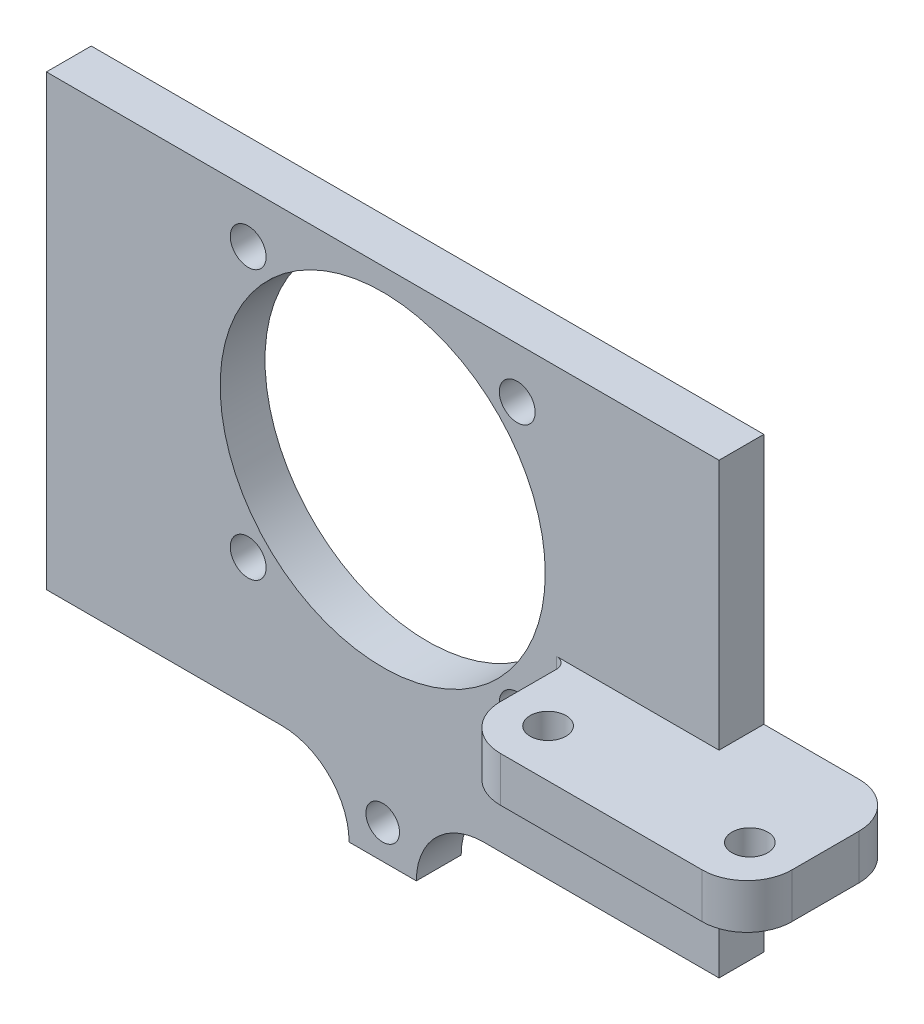
ISO-10303-21;
HEADER;
FILE_DESCRIPTION(('STEP AP214'),'2;1');
FILE_NAME('part.step','',(''),(''),'','','');
FILE_SCHEMA(('AUTOMOTIVE_DESIGN { 1 0 10303 214 1 1 1 1 }'));
ENDSEC;
DATA;
#1=APPLICATION_CONTEXT('core data for automotive mechanical design processes');
#2=APPLICATION_PROTOCOL_DEFINITION('international standard','automotive_design',2000,#1);
#3=PRODUCT_CONTEXT('',#1,'mechanical');
#4=PRODUCT('Part','Part','',(#3));
#5=PRODUCT_RELATED_PRODUCT_CATEGORY('part','',(#4));
#6=PRODUCT_DEFINITION_FORMATION('','',#4);
#7=PRODUCT_DEFINITION_CONTEXT('part definition',#1,'design');
#8=PRODUCT_DEFINITION('design','',#6,#7);
#9=PRODUCT_DEFINITION_SHAPE('','',#8);
#10=(LENGTH_UNIT() NAMED_UNIT(*) SI_UNIT(.MILLI.,.METRE.));
#11=(NAMED_UNIT(*) PLANE_ANGLE_UNIT() SI_UNIT($,.RADIAN.));
#12=(NAMED_UNIT(*) SI_UNIT($,.STERADIAN.) SOLID_ANGLE_UNIT());
#13=UNCERTAINTY_MEASURE_WITH_UNIT(LENGTH_MEASURE(1.E-05),#10,'distance_accuracy_value','');
#14=(GEOMETRIC_REPRESENTATION_CONTEXT(3) GLOBAL_UNCERTAINTY_ASSIGNED_CONTEXT((#13)) GLOBAL_UNIT_ASSIGNED_CONTEXT((#10,
#11,#12)) REPRESENTATION_CONTEXT('',''));
#15=CARTESIAN_POINT('',(0.,0.,0.));
#16=DIRECTION('',(0.,0.,1.));
#17=DIRECTION('',(1.,0.,0.));
#18=AXIS2_PLACEMENT_3D('',#15,#16,#17);
#19=CARTESIAN_POINT('',(0.,0.,4.));
#20=DIRECTION('',(0.,1.,0.));
#21=DIRECTION('',(0.,0.,1.));
#22=AXIS2_PLACEMENT_3D('',#19,#20,#21);
#23=PLANE('',#22);
#24=DIRECTION('',(1.,0.,0.));
#25=VECTOR('',#24,1.);
#26=CARTESIAN_POINT('',(0.,0.,4.));
#27=LINE('',#26,#25);
#28=CARTESIAN_POINT('',(39.,0.,4.));
#29=VERTEX_POINT('',#28);
#30=CARTESIAN_POINT('',(60.,0.,4.));
#31=VERTEX_POINT('',#30);
#32=EDGE_CURVE('E268',#29,#31,#27,.T.);
#33=ORIENTED_EDGE('',*,*,#32,.F.);
#34=DIRECTION('',(0.,0.,1.));
#35=VECTOR('',#34,1.);
#36=CARTESIAN_POINT('',(39.,0.,0.));
#37=LINE('',#36,#35);
#38=CARTESIAN_POINT('',(39.,0.,0.));
#39=VERTEX_POINT('',#38);
#40=EDGE_CURVE('E56',#29,#39,#37,.F.);
#41=ORIENTED_EDGE('',*,*,#40,.T.);
#42=DIRECTION('',(1.,0.,0.));
#43=VECTOR('',#42,1.);
#44=CARTESIAN_POINT('',(0.,0.,0.));
#45=LINE('',#44,#43);
#46=CARTESIAN_POINT('',(60.,0.,0.));
#47=VERTEX_POINT('',#46);
#48=EDGE_CURVE('E280',#39,#47,#45,.T.);
#49=ORIENTED_EDGE('',*,*,#48,.T.);
#50=DIRECTION('',(0.,0.,-1.));
#51=VECTOR('',#50,1.);
#52=CARTESIAN_POINT('',(60.,0.,4.));
#53=LINE('',#52,#51);
#54=EDGE_CURVE('E294',#31,#47,#53,.T.);
#55=ORIENTED_EDGE('',*,*,#54,.F.);
#56=EDGE_LOOP('',(#33,#41,#49,#55));
#57=FACE_BOUND('',#56,.T.);
#58=ADVANCED_FACE('F35',(#57),#23,.F.);
#59=CARTESIAN_POINT('',(0.,0.,0.));
#60=VERTEX_POINT('',#59);
#61=CARTESIAN_POINT('',(21.,0.,0.));
#62=VERTEX_POINT('',#61);
#63=EDGE_CURVE('E281',#60,#62,#45,.T.);
#64=ORIENTED_EDGE('',*,*,#63,.T.);
#65=DIRECTION('',(0.,0.,-1.));
#66=VECTOR('',#65,1.);
#67=CARTESIAN_POINT('',(21.,0.,4.));
#68=LINE('',#67,#66);
#69=CARTESIAN_POINT('',(21.,0.,4.));
#70=VERTEX_POINT('',#69);
#71=EDGE_CURVE('E343',#62,#70,#68,.F.);
#72=ORIENTED_EDGE('',*,*,#71,.T.);
#73=CARTESIAN_POINT('',(0.,0.,4.));
#74=VERTEX_POINT('',#73);
#75=EDGE_CURVE('E270',#74,#70,#27,.T.);
#76=ORIENTED_EDGE('',*,*,#75,.F.);
#77=DIRECTION('',(0.,0.,-1.));
#78=VECTOR('',#77,1.);
#79=CARTESIAN_POINT('',(0.,0.,4.));
#80=LINE('',#79,#78);
#81=EDGE_CURVE('E222',#74,#60,#80,.T.);
#82=ORIENTED_EDGE('',*,*,#81,.T.);
#83=EDGE_LOOP('',(#64,#72,#76,#82));
#84=FACE_BOUND('',#83,.T.);
#85=ADVANCED_FACE('F359',(#84),#23,.F.);
#86=CARTESIAN_POINT('',(60.,0.,4.));
#87=DIRECTION('',(-1.,0.,0.));
#88=DIRECTION('',(0.,0.,1.));
#89=AXIS2_PLACEMENT_3D('',#86,#87,#88);
#90=PLANE('',#89);
#91=DIRECTION('',(0.,1.,0.));
#92=VECTOR('',#91,1.);
#93=CARTESIAN_POINT('',(60.,0.,0.));
#94=LINE('',#93,#92);
#95=CARTESIAN_POINT('',(60.,12.5999999999763,0.));
#96=VERTEX_POINT('',#95);
#97=EDGE_CURVE('E285',#47,#96,#94,.T.);
#98=ORIENTED_EDGE('',*,*,#97,.T.);
#99=DIRECTION('',(0.,0.,-1.));
#100=VECTOR('',#99,1.);
#101=CARTESIAN_POINT('',(60.,12.5999999999763,4.));
#102=LINE('',#101,#100);
#103=CARTESIAN_POINT('',(60.,12.5999999999763,4.));
#104=VERTEX_POINT('',#103);
#105=EDGE_CURVE('E330',#96,#104,#102,.F.);
#106=ORIENTED_EDGE('',*,*,#105,.T.);
#107=DIRECTION('',(0.,1.,0.));
#108=VECTOR('',#107,1.);
#109=CARTESIAN_POINT('',(60.,0.,4.));
#110=LINE('',#109,#108);
#111=EDGE_CURVE('E273',#31,#104,#110,.T.);
#112=ORIENTED_EDGE('',*,*,#111,.F.);
#113=ORIENTED_EDGE('',*,*,#54,.T.);
#114=EDGE_LOOP('',(#98,#106,#112,#113));
#115=FACE_BOUND('',#114,.T.);
#116=ADVANCED_FACE('F377',(#115),#90,.F.);
#117=DIRECTION('',(0.,0.,1.));
#118=VECTOR('',#117,1.);
#119=CARTESIAN_POINT('',(60.,17.5999999999763,4.));
#120=LINE('',#119,#118);
#121=CARTESIAN_POINT('',(60.,17.5999999999763,0.));
#122=VERTEX_POINT('',#121);
#123=CARTESIAN_POINT('',(60.,17.5999999999763,4.));
#124=VERTEX_POINT('',#123);
#125=EDGE_CURVE('E192',#122,#124,#120,.T.);
#126=ORIENTED_EDGE('',*,*,#125,.F.);
#127=CARTESIAN_POINT('',(60.,40.,0.));
#128=VERTEX_POINT('',#127);
#129=EDGE_CURVE('E284',#122,#128,#94,.T.);
#130=ORIENTED_EDGE('',*,*,#129,.T.);
#131=DIRECTION('',(0.,0.,-1.));
#132=VECTOR('',#131,1.);
#133=CARTESIAN_POINT('',(60.,40.,4.));
#134=LINE('',#133,#132);
#135=CARTESIAN_POINT('',(60.,40.,4.));
#136=VERTEX_POINT('',#135);
#137=EDGE_CURVE('E291',#136,#128,#134,.T.);
#138=ORIENTED_EDGE('',*,*,#137,.F.);
#139=EDGE_CURVE('E272',#124,#136,#110,.T.);
#140=ORIENTED_EDGE('',*,*,#139,.F.);
#141=EDGE_LOOP('',(#126,#130,#138,#140));
#142=FACE_BOUND('',#141,.T.);
#143=ADVANCED_FACE('F444',(#142),#90,.F.);
#144=CARTESIAN_POINT('',(0.,0.,4.));
#145=DIRECTION('',(0.,0.,-1.));
#146=DIRECTION('',(-1.,0.,0.));
#147=AXIS2_PLACEMENT_3D('',#144,#145,#146);
#148=PLANE('',#147);
#149=CARTESIAN_POINT('',(30.,-3.,4.));
#150=DIRECTION('',(0.,0.,1.));
#151=DIRECTION('',(1.,0.,0.));
#152=AXIS2_PLACEMENT_3D('',#149,#150,#151);
#153=CIRCLE('',#152,1.5);
#154=CARTESIAN_POINT('',(31.5,-3.,4.));
#155=VERTEX_POINT('',#154);
#156=EDGE_CURVE('E185',#155,#155,#153,.T.);
#157=ORIENTED_EDGE('',*,*,#156,.F.);
#158=EDGE_LOOP('',(#157));
#159=FACE_BOUND('',#158,.T.);
#160=CARTESIAN_POINT('',(30.,23.5,4.));
#161=DIRECTION('',(0.,0.,1.));
#162=DIRECTION('',(1.,0.,0.));
#163=AXIS2_PLACEMENT_3D('',#160,#161,#162);
#164=CIRCLE('',#163,14.5);
#165=CARTESIAN_POINT('',(44.5,23.5,4.));
#166=VERTEX_POINT('',#165);
#167=EDGE_CURVE('E256',#166,#166,#164,.T.);
#168=ORIENTED_EDGE('',*,*,#167,.F.);
#169=EDGE_LOOP('',(#168));
#170=FACE_BOUND('',#169,.T.);
#171=CARTESIAN_POINT('',(42.0000000000001,11.4999999999967,4.));
#172=DIRECTION('',(0.,0.,1.));
#173=DIRECTION('',(1.,0.,0.));
#174=AXIS2_PLACEMENT_3D('',#171,#172,#173);
#175=CIRCLE('',#174,1.60000000000088);
#176=CARTESIAN_POINT('',(43.600000000001,11.4999999999967,4.));
#177=VERTEX_POINT('',#176);
#178=EDGE_CURVE('E238',#177,#177,#175,.T.);
#179=ORIENTED_EDGE('',*,*,#178,.F.);
#180=EDGE_LOOP('',(#179));
#181=FACE_BOUND('',#180,.T.);
#182=CARTESIAN_POINT('',(18.0000000000002,11.4999999999966,4.));
#183=DIRECTION('',(0.,0.,1.));
#184=DIRECTION('',(1.,0.,0.));
#185=AXIS2_PLACEMENT_3D('',#182,#183,#184);
#186=CIRCLE('',#185,1.60000000000088);
#187=CARTESIAN_POINT('',(19.6000000000011,11.4999999999966,4.));
#188=VERTEX_POINT('',#187);
#189=EDGE_CURVE('E239',#188,#188,#186,.T.);
#190=ORIENTED_EDGE('',*,*,#189,.F.);
#191=EDGE_LOOP('',(#190));
#192=FACE_BOUND('',#191,.T.);
#193=CARTESIAN_POINT('',(18.,35.4999999999966,4.));
#194=DIRECTION('',(0.,0.,1.));
#195=DIRECTION('',(1.,0.,0.));
#196=AXIS2_PLACEMENT_3D('',#193,#194,#195);
#197=CIRCLE('',#196,1.60000000000088);
#198=CARTESIAN_POINT('',(19.6000000000009,35.4999999999966,4.));
#199=VERTEX_POINT('',#198);
#200=EDGE_CURVE('E245',#199,#199,#197,.T.);
#201=ORIENTED_EDGE('',*,*,#200,.F.);
#202=EDGE_LOOP('',(#201));
#203=FACE_BOUND('',#202,.T.);
#204=CARTESIAN_POINT('',(42.0000000000001,35.4999999999967,4.));
#205=DIRECTION('',(0.,0.,1.));
#206=DIRECTION('',(1.,0.,0.));
#207=AXIS2_PLACEMENT_3D('',#204,#205,#206);
#208=CIRCLE('',#207,1.60000000000088);
#209=CARTESIAN_POINT('',(43.6000000000009,35.4999999999967,4.));
#210=VERTEX_POINT('',#209);
#211=EDGE_CURVE('E234',#210,#210,#208,.T.);
#212=ORIENTED_EDGE('',*,*,#211,.F.);
#213=EDGE_LOOP('',(#212));
#214=FACE_BOUND('',#213,.T.);
#215=ORIENTED_EDGE('',*,*,#111,.T.);
#216=DIRECTION('',(1.,0.,0.));
#217=VECTOR('',#216,1.);
#218=CARTESIAN_POINT('',(46.5000000000019,12.5999999999763,4.));
#219=LINE('',#218,#217);
#220=CARTESIAN_POINT('',(45.5000000000019,12.5999999999763,4.));
#221=VERTEX_POINT('',#220);
#222=EDGE_CURVE('E335',#104,#221,#219,.F.);
#223=ORIENTED_EDGE('',*,*,#222,.T.);
#224=DIRECTION('',(0.,-1.,0.));
#225=VECTOR('',#224,1.);
#226=CARTESIAN_POINT('',(45.5000000000019,17.5999999999763,4.));
#227=LINE('',#226,#225);
#228=CARTESIAN_POINT('',(45.5000000000019,17.5999999999763,4.));
#229=VERTEX_POINT('',#228);
#230=EDGE_CURVE('E332',#221,#229,#227,.F.);
#231=ORIENTED_EDGE('',*,*,#230,.T.);
#232=DIRECTION('',(-1.,0.,0.));
#233=VECTOR('',#232,1.);
#234=CARTESIAN_POINT('',(46.5000000000019,17.5999999999763,4.));
#235=LINE('',#234,#233);
#236=EDGE_CURVE('E219',#124,#229,#235,.T.);
#237=ORIENTED_EDGE('',*,*,#236,.F.);
#238=ORIENTED_EDGE('',*,*,#139,.T.);
#239=DIRECTION('',(-1.,0.,0.));
#240=VECTOR('',#239,1.);
#241=CARTESIAN_POINT('',(0.,40.,4.));
#242=LINE('',#241,#240);
#243=CARTESIAN_POINT('',(0.,40.,4.));
#244=VERTEX_POINT('',#243);
#245=EDGE_CURVE('E275',#136,#244,#242,.T.);
#246=ORIENTED_EDGE('',*,*,#245,.T.);
#247=DIRECTION('',(0.,-1.,0.));
#248=VECTOR('',#247,1.);
#249=CARTESIAN_POINT('',(0.,0.,4.));
#250=LINE('',#249,#248);
#251=EDGE_CURVE('E265',#244,#74,#250,.T.);
#252=ORIENTED_EDGE('',*,*,#251,.T.);
#253=ORIENTED_EDGE('',*,*,#75,.T.);
#254=CARTESIAN_POINT('',(21.,-6.,4.));
#255=DIRECTION('',(0.,0.,-1.));
#256=DIRECTION('',(-1.,0.,0.));
#257=AXIS2_PLACEMENT_3D('',#254,#255,#256);
#258=CIRCLE('',#257,6.);
#259=CARTESIAN_POINT('',(27.,-6.,4.));
#260=VERTEX_POINT('',#259);
#261=EDGE_CURVE('E166',#70,#260,#258,.T.);
#262=ORIENTED_EDGE('',*,*,#261,.T.);
#263=DIRECTION('',(-1.,0.,0.));
#264=VECTOR('',#263,1.);
#265=CARTESIAN_POINT('',(33.,-6.,4.));
#266=LINE('',#265,#264);
#267=CARTESIAN_POINT('',(33.,-6.,4.));
#268=VERTEX_POINT('',#267);
#269=EDGE_CURVE('E168',#268,#260,#266,.T.);
#270=ORIENTED_EDGE('',*,*,#269,.F.);
#271=CARTESIAN_POINT('',(39.,-6.,4.));
#272=DIRECTION('',(0.,0.,-1.));
#273=DIRECTION('',(-1.,0.,0.));
#274=AXIS2_PLACEMENT_3D('',#271,#272,#273);
#275=CIRCLE('',#274,6.);
#276=EDGE_CURVE('E43',#268,#29,#275,.T.);
#277=ORIENTED_EDGE('',*,*,#276,.T.);
#278=ORIENTED_EDGE('',*,*,#32,.T.);
#279=EDGE_LOOP('',(#215,#223,#231,#237,#238,#246,#252,#253,#262,#270,#277,#278));
#280=FACE_BOUND('',#279,.T.);
#281=ADVANCED_FACE('F170',(#159,#170,#181,#192,#203,#214,#280),#148,.F.);
#282=CARTESIAN_POINT('',(0.,0.,4.));
#283=DIRECTION('',(1.,0.,0.));
#284=DIRECTION('',(0.,0.,-1.));
#285=AXIS2_PLACEMENT_3D('',#282,#283,#284);
#286=PLANE('',#285);
#287=DIRECTION('',(0.,-1.,0.));
#288=VECTOR('',#287,1.);
#289=CARTESIAN_POINT('',(0.,0.,0.));
#290=LINE('',#289,#288);
#291=CARTESIAN_POINT('',(0.,40.,0.));
#292=VERTEX_POINT('',#291);
#293=EDGE_CURVE('E262',#292,#60,#290,.T.);
#294=ORIENTED_EDGE('',*,*,#293,.T.);
#295=ORIENTED_EDGE('',*,*,#81,.F.);
#296=ORIENTED_EDGE('',*,*,#251,.F.);
#297=DIRECTION('',(0.,0.,-1.));
#298=VECTOR('',#297,1.);
#299=CARTESIAN_POINT('',(0.,40.,4.));
#300=LINE('',#299,#298);
#301=EDGE_CURVE('E277',#244,#292,#300,.T.);
#302=ORIENTED_EDGE('',*,*,#301,.T.);
#303=EDGE_LOOP('',(#294,#295,#296,#302));
#304=FACE_BOUND('',#303,.T.);
#305=ADVANCED_FACE('F381',(#304),#286,.F.);
#306=CARTESIAN_POINT('',(0.,40.,4.));
#307=DIRECTION('',(0.,-1.,0.));
#308=DIRECTION('',(0.,0.,-1.));
#309=AXIS2_PLACEMENT_3D('',#306,#307,#308);
#310=PLANE('',#309);
#311=DIRECTION('',(-1.,0.,0.));
#312=VECTOR('',#311,1.);
#313=CARTESIAN_POINT('',(0.,40.,0.));
#314=LINE('',#313,#312);
#315=EDGE_CURVE('E269',#128,#292,#314,.T.);
#316=ORIENTED_EDGE('',*,*,#315,.T.);
#317=ORIENTED_EDGE('',*,*,#301,.F.);
#318=ORIENTED_EDGE('',*,*,#245,.F.);
#319=ORIENTED_EDGE('',*,*,#137,.T.);
#320=EDGE_LOOP('',(#316,#317,#318,#319));
#321=FACE_BOUND('',#320,.T.);
#322=ADVANCED_FACE('F384',(#321),#310,.F.);
#323=CARTESIAN_POINT('',(0.,0.,0.));
#324=DIRECTION('',(0.,0.,-1.));
#325=DIRECTION('',(-1.,0.,0.));
#326=AXIS2_PLACEMENT_3D('',#323,#324,#325);
#327=PLANE('',#326);
#328=CARTESIAN_POINT('',(30.,-3.,0.));
#329=DIRECTION('',(0.,0.,-1.));
#330=DIRECTION('',(-1.,0.,0.));
#331=AXIS2_PLACEMENT_3D('',#328,#329,#330);
#332=CIRCLE('',#331,1.5);
#333=CARTESIAN_POINT('',(28.5,-3.,0.));
#334=VERTEX_POINT('',#333);
#335=EDGE_CURVE('E182',#334,#334,#332,.T.);
#336=ORIENTED_EDGE('',*,*,#335,.F.);
#337=EDGE_LOOP('',(#336));
#338=FACE_BOUND('',#337,.T.);
#339=CARTESIAN_POINT('',(42.0000000000001,35.4999999999967,0.));
#340=DIRECTION('',(0.,0.,1.));
#341=DIRECTION('',(1.,0.,0.));
#342=AXIS2_PLACEMENT_3D('',#339,#340,#341);
#343=CIRCLE('',#342,1.60000000000088);
#344=CARTESIAN_POINT('',(43.6000000000009,35.4999999999967,0.));
#345=VERTEX_POINT('',#344);
#346=EDGE_CURVE('E248',#345,#345,#343,.T.);
#347=ORIENTED_EDGE('',*,*,#346,.T.);
#348=EDGE_LOOP('',(#347));
#349=FACE_BOUND('',#348,.T.);
#350=CARTESIAN_POINT('',(18.,35.4999999999966,0.));
#351=DIRECTION('',(0.,0.,1.));
#352=DIRECTION('',(1.,0.,0.));
#353=AXIS2_PLACEMENT_3D('',#350,#351,#352);
#354=CIRCLE('',#353,1.60000000000088);
#355=CARTESIAN_POINT('',(19.6000000000009,35.4999999999966,0.));
#356=VERTEX_POINT('',#355);
#357=EDGE_CURVE('E242',#356,#356,#354,.T.);
#358=ORIENTED_EDGE('',*,*,#357,.T.);
#359=EDGE_LOOP('',(#358));
#360=FACE_BOUND('',#359,.T.);
#361=CARTESIAN_POINT('',(18.0000000000002,11.4999999999966,0.));
#362=DIRECTION('',(0.,0.,1.));
#363=DIRECTION('',(1.,0.,0.));
#364=AXIS2_PLACEMENT_3D('',#361,#362,#363);
#365=CIRCLE('',#364,1.60000000000088);
#366=CARTESIAN_POINT('',(19.6000000000011,11.4999999999966,0.));
#367=VERTEX_POINT('',#366);
#368=EDGE_CURVE('E235',#367,#367,#365,.T.);
#369=ORIENTED_EDGE('',*,*,#368,.T.);
#370=EDGE_LOOP('',(#369));
#371=FACE_BOUND('',#370,.T.);
#372=CARTESIAN_POINT('',(42.0000000000001,11.4999999999967,0.));
#373=DIRECTION('',(0.,0.,1.));
#374=DIRECTION('',(1.,0.,0.));
#375=AXIS2_PLACEMENT_3D('',#372,#373,#374);
#376=CIRCLE('',#375,1.60000000000088);
#377=CARTESIAN_POINT('',(43.600000000001,11.4999999999967,0.));
#378=VERTEX_POINT('',#377);
#379=EDGE_CURVE('E253',#378,#378,#376,.T.);
#380=ORIENTED_EDGE('',*,*,#379,.T.);
#381=EDGE_LOOP('',(#380));
#382=FACE_BOUND('',#381,.T.);
#383=CARTESIAN_POINT('',(30.,23.5,0.));
#384=DIRECTION('',(0.,0.,1.));
#385=DIRECTION('',(1.,0.,0.));
#386=AXIS2_PLACEMENT_3D('',#383,#384,#385);
#387=CIRCLE('',#386,14.5);
#388=CARTESIAN_POINT('',(44.5,23.5,0.));
#389=VERTEX_POINT('',#388);
#390=EDGE_CURVE('E259',#389,#389,#387,.T.);
#391=ORIENTED_EDGE('',*,*,#390,.T.);
#392=EDGE_LOOP('',(#391));
#393=FACE_BOUND('',#392,.T.);
#394=DIRECTION('',(-1.,0.,0.));
#395=VECTOR('',#394,1.);
#396=CARTESIAN_POINT('',(72.5,17.5999999999763,0.));
#397=LINE('',#396,#395);
#398=CARTESIAN_POINT('',(68.5000000000019,17.5999999999763,0.));
#399=VERTEX_POINT('',#398);
#400=EDGE_CURVE('E194',#399,#122,#397,.T.);
#401=ORIENTED_EDGE('',*,*,#400,.F.);
#402=DIRECTION('',(0.,1.,0.));
#403=VECTOR('',#402,1.);
#404=CARTESIAN_POINT('',(68.5000000000019,13.5999999999763,0.));
#405=LINE('',#404,#403);
#406=CARTESIAN_POINT('',(68.5000000000019,13.5999999999763,0.));
#407=VERTEX_POINT('',#406);
#408=EDGE_CURVE('E309',#399,#407,#405,.F.);
#409=ORIENTED_EDGE('',*,*,#408,.T.);
#410=DIRECTION('',(-1.,0.,0.));
#411=VECTOR('',#410,1.);
#412=CARTESIAN_POINT('',(72.5,13.5999999999763,0.));
#413=LINE('',#412,#411);
#414=CARTESIAN_POINT('',(61.,13.5999999999763,0.));
#415=VERTEX_POINT('',#414);
#416=EDGE_CURVE('E197',#407,#415,#413,.T.);
#417=ORIENTED_EDGE('',*,*,#416,.T.);
#418=CARTESIAN_POINT('',(61.,12.5999999999763,0.));
#419=DIRECTION('',(0.,0.,-1.));
#420=DIRECTION('',(-1.,0.,0.));
#421=AXIS2_PLACEMENT_3D('',#418,#419,#420);
#422=CIRCLE('',#421,1.);
#423=EDGE_CURVE('E339',#415,#96,#422,.F.);
#424=ORIENTED_EDGE('',*,*,#423,.T.);
#425=ORIENTED_EDGE('',*,*,#97,.F.);
#426=ORIENTED_EDGE('',*,*,#48,.F.);
#427=CARTESIAN_POINT('',(39.,-6.,0.));
#428=DIRECTION('',(0.,0.,-1.));
#429=DIRECTION('',(-1.,0.,0.));
#430=AXIS2_PLACEMENT_3D('',#427,#428,#429);
#431=CIRCLE('',#430,6.);
#432=CARTESIAN_POINT('',(33.,-6.,0.));
#433=VERTEX_POINT('',#432);
#434=EDGE_CURVE('E11',#39,#433,#431,.F.);
#435=ORIENTED_EDGE('',*,*,#434,.T.);
#436=DIRECTION('',(1.,0.,0.));
#437=VECTOR('',#436,1.);
#438=CARTESIAN_POINT('',(33.,-6.,0.));
#439=LINE('',#438,#437);
#440=CARTESIAN_POINT('',(27.,-6.,0.));
#441=VERTEX_POINT('',#440);
#442=EDGE_CURVE('E181',#441,#433,#439,.T.);
#443=ORIENTED_EDGE('',*,*,#442,.F.);
#444=CARTESIAN_POINT('',(21.,-6.,0.));
#445=DIRECTION('',(0.,0.,-1.));
#446=DIRECTION('',(-1.,0.,0.));
#447=AXIS2_PLACEMENT_3D('',#444,#445,#446);
#448=CIRCLE('',#447,6.);
#449=EDGE_CURVE('E350',#441,#62,#448,.F.);
#450=ORIENTED_EDGE('',*,*,#449,.T.);
#451=ORIENTED_EDGE('',*,*,#63,.F.);
#452=ORIENTED_EDGE('',*,*,#293,.F.);
#453=ORIENTED_EDGE('',*,*,#315,.F.);
#454=ORIENTED_EDGE('',*,*,#129,.F.);
#455=EDGE_LOOP('',(#401,#409,#417,#424,#425,#426,#435,#443,#450,#451,#452,#453,#454));
#456=FACE_BOUND('',#455,.T.);
#457=ADVANCED_FACE('F354',(#338,#349,#360,#371,#382,#393,#456),#327,.T.);
#458=CARTESIAN_POINT('',(30.,23.5,0.));
#459=DIRECTION('',(0.,0.,1.));
#460=DIRECTION('',(1.,0.,0.));
#461=AXIS2_PLACEMENT_3D('',#458,#459,#460);
#462=CYLINDRICAL_SURFACE('',#461,14.5);
#463=ORIENTED_EDGE('',*,*,#390,.F.);
#464=EDGE_LOOP('',(#463));
#465=FACE_BOUND('',#464,.T.);
#466=ORIENTED_EDGE('',*,*,#167,.T.);
#467=EDGE_LOOP('',(#466));
#468=FACE_BOUND('',#467,.T.);
#469=ADVANCED_FACE('F478',(#465,#468),#462,.F.);
#470=CARTESIAN_POINT('',(42.0000000000001,11.4999999999967,0.));
#471=DIRECTION('',(0.,0.,1.));
#472=DIRECTION('',(1.,0.,0.));
#473=AXIS2_PLACEMENT_3D('',#470,#471,#472);
#474=CYLINDRICAL_SURFACE('',#473,1.60000000000088);
#475=ORIENTED_EDGE('',*,*,#379,.F.);
#476=EDGE_LOOP('',(#475));
#477=FACE_BOUND('',#476,.T.);
#478=ORIENTED_EDGE('',*,*,#178,.T.);
#479=EDGE_LOOP('',(#478));
#480=FACE_BOUND('',#479,.T.);
#481=ADVANCED_FACE('F492',(#477,#480),#474,.F.);
#482=CARTESIAN_POINT('',(18.0000000000002,11.4999999999966,0.));
#483=DIRECTION('',(0.,0.,1.));
#484=DIRECTION('',(1.,0.,0.));
#485=AXIS2_PLACEMENT_3D('',#482,#483,#484);
#486=CYLINDRICAL_SURFACE('',#485,1.60000000000088);
#487=ORIENTED_EDGE('',*,*,#368,.F.);
#488=EDGE_LOOP('',(#487));
#489=FACE_BOUND('',#488,.T.);
#490=ORIENTED_EDGE('',*,*,#189,.T.);
#491=EDGE_LOOP('',(#490));
#492=FACE_BOUND('',#491,.T.);
#493=ADVANCED_FACE('F499',(#489,#492),#486,.F.);
#494=CARTESIAN_POINT('',(18.,35.4999999999966,0.));
#495=DIRECTION('',(0.,0.,1.));
#496=DIRECTION('',(1.,0.,0.));
#497=AXIS2_PLACEMENT_3D('',#494,#495,#496);
#498=CYLINDRICAL_SURFACE('',#497,1.60000000000088);
#499=ORIENTED_EDGE('',*,*,#357,.F.);
#500=EDGE_LOOP('',(#499));
#501=FACE_BOUND('',#500,.T.);
#502=ORIENTED_EDGE('',*,*,#200,.T.);
#503=EDGE_LOOP('',(#502));
#504=FACE_BOUND('',#503,.T.);
#505=ADVANCED_FACE('F506',(#501,#504),#498,.F.);
#506=CARTESIAN_POINT('',(42.0000000000001,35.4999999999967,0.));
#507=DIRECTION('',(0.,0.,1.));
#508=DIRECTION('',(1.,0.,0.));
#509=AXIS2_PLACEMENT_3D('',#506,#507,#508);
#510=CYLINDRICAL_SURFACE('',#509,1.60000000000088);
#511=ORIENTED_EDGE('',*,*,#346,.F.);
#512=EDGE_LOOP('',(#511));
#513=FACE_BOUND('',#512,.T.);
#514=ORIENTED_EDGE('',*,*,#211,.T.);
#515=EDGE_LOOP('',(#514));
#516=FACE_BOUND('',#515,.T.);
#517=ADVANCED_FACE('F514',(#513,#516),#510,.F.);
#518=CARTESIAN_POINT('',(46.5000000000019,17.5999999999763,14.));
#519=DIRECTION('',(1.,0.,0.));
#520=DIRECTION('',(0.,0.,-1.));
#521=AXIS2_PLACEMENT_3D('',#518,#519,#520);
#522=PLANE('',#521);
#523=DIRECTION('',(0.,0.,-1.));
#524=VECTOR('',#523,1.);
#525=CARTESIAN_POINT('',(46.5000000000019,17.5999999999763,14.));
#526=LINE('',#525,#524);
#527=CARTESIAN_POINT('',(46.5000000000019,17.5999999999763,10.));
#528=VERTEX_POINT('',#527);
#529=CARTESIAN_POINT('',(46.5000000000019,17.5999999999763,5.));
#530=VERTEX_POINT('',#529);
#531=EDGE_CURVE('E218',#528,#530,#526,.T.);
#532=ORIENTED_EDGE('',*,*,#531,.T.);
#533=DIRECTION('',(0.,-1.,0.));
#534=VECTOR('',#533,1.);
#535=CARTESIAN_POINT('',(46.5000000000019,13.5999999999763,5.));
#536=LINE('',#535,#534);
#537=CARTESIAN_POINT('',(46.5000000000019,13.5999999999763,5.));
#538=VERTEX_POINT('',#537);
#539=EDGE_CURVE('E337',#530,#538,#536,.T.);
#540=ORIENTED_EDGE('',*,*,#539,.T.);
#541=DIRECTION('',(0.,0.,-1.));
#542=VECTOR('',#541,1.);
#543=CARTESIAN_POINT('',(46.5000000000019,13.5999999999763,14.));
#544=LINE('',#543,#542);
#545=CARTESIAN_POINT('',(46.5000000000019,13.5999999999763,10.));
#546=VERTEX_POINT('',#545);
#547=EDGE_CURVE('E231',#546,#538,#544,.T.);
#548=ORIENTED_EDGE('',*,*,#547,.F.);
#549=DIRECTION('',(0.,-1.,0.));
#550=VECTOR('',#549,1.);
#551=CARTESIAN_POINT('',(46.5000000000019,17.5999999999763,10.));
#552=LINE('',#551,#550);
#553=EDGE_CURVE('E323',#546,#528,#552,.F.);
#554=ORIENTED_EDGE('',*,*,#553,.T.);
#555=EDGE_LOOP('',(#532,#540,#548,#554));
#556=FACE_BOUND('',#555,.T.);
#557=ADVANCED_FACE('F420',(#556),#522,.F.);
#558=CARTESIAN_POINT('',(46.5000000000019,13.5999999999763,14.));
#559=DIRECTION('',(0.,1.,0.));
#560=DIRECTION('',(-1.,0.,0.));
#561=AXIS2_PLACEMENT_3D('',#558,#559,#560);
#562=PLANE('',#561);
#563=CARTESIAN_POINT('',(68.5000000000007,13.5999999999763,9.74999999999541));
#564=DIRECTION('',(0.,1.,0.));
#565=DIRECTION('',(-1.,0.,0.));
#566=AXIS2_PLACEMENT_3D('',#563,#564,#565);
#567=CIRCLE('',#566,1.59999999999823);
#568=CARTESIAN_POINT('',(66.9000000000024,13.5999999999763,9.74999999999541));
#569=VERTEX_POINT('',#568);
#570=EDGE_CURVE('E209',#569,#569,#567,.T.);
#571=ORIENTED_EDGE('',*,*,#570,.T.);
#572=EDGE_LOOP('',(#571));
#573=FACE_BOUND('',#572,.T.);
#574=CARTESIAN_POINT('',(50.5000000000007,13.5999999999763,9.74999999999541));
#575=DIRECTION('',(0.,1.,0.));
#576=DIRECTION('',(-1.,0.,0.));
#577=AXIS2_PLACEMENT_3D('',#574,#575,#576);
#578=CIRCLE('',#577,1.59999999999822);
#579=CARTESIAN_POINT('',(48.9000000000024,13.5999999999763,9.74999999999541));
#580=VERTEX_POINT('',#579);
#581=EDGE_CURVE('E204',#580,#580,#578,.T.);
#582=ORIENTED_EDGE('',*,*,#581,.T.);
#583=EDGE_LOOP('',(#582));
#584=FACE_BOUND('',#583,.T.);
#585=DIRECTION('',(1.,0.,0.));
#586=VECTOR('',#585,1.);
#587=CARTESIAN_POINT('',(60.,13.5999999999763,5.));
#588=LINE('',#587,#586);
#589=CARTESIAN_POINT('',(61.,13.5999999999763,5.));
#590=VERTEX_POINT('',#589);
#591=EDGE_CURVE('E325',#538,#590,#588,.T.);
#592=ORIENTED_EDGE('',*,*,#591,.T.);
#593=DIRECTION('',(0.,0.,-1.));
#594=VECTOR('',#593,1.);
#595=CARTESIAN_POINT('',(61.,13.5999999999763,0.));
#596=LINE('',#595,#594);
#597=EDGE_CURVE('E327',#590,#415,#596,.T.);
#598=ORIENTED_EDGE('',*,*,#597,.T.);
#599=ORIENTED_EDGE('',*,*,#416,.F.);
#600=CARTESIAN_POINT('',(68.5000000000019,13.5999999999763,4.));
#601=DIRECTION('',(0.,1.,0.));
#602=DIRECTION('',(-1.,0.,0.));
#603=AXIS2_PLACEMENT_3D('',#600,#601,#602);
#604=CIRCLE('',#603,4.);
#605=CARTESIAN_POINT('',(72.5000000000019,13.5999999999763,4.));
#606=VERTEX_POINT('',#605);
#607=EDGE_CURVE('E315',#407,#606,#604,.F.);
#608=ORIENTED_EDGE('',*,*,#607,.T.);
#609=DIRECTION('',(0.,0.,-1.));
#610=VECTOR('',#609,1.);
#611=CARTESIAN_POINT('',(72.5000000000019,13.5999999999763,14.));
#612=LINE('',#611,#610);
#613=CARTESIAN_POINT('',(72.5000000000019,13.5999999999763,10.));
#614=VERTEX_POINT('',#613);
#615=EDGE_CURVE('E228',#614,#606,#612,.T.);
#616=ORIENTED_EDGE('',*,*,#615,.F.);
#617=CARTESIAN_POINT('',(68.5000000000019,13.5999999999763,10.));
#618=DIRECTION('',(0.,1.,0.));
#619=DIRECTION('',(-1.,0.,0.));
#620=AXIS2_PLACEMENT_3D('',#617,#618,#619);
#621=CIRCLE('',#620,4.);
#622=CARTESIAN_POINT('',(68.5000000000019,13.5999999999763,14.));
#623=VERTEX_POINT('',#622);
#624=EDGE_CURVE('E313',#614,#623,#621,.F.);
#625=ORIENTED_EDGE('',*,*,#624,.T.);
#626=DIRECTION('',(1.,0.,0.));
#627=VECTOR('',#626,1.);
#628=CARTESIAN_POINT('',(46.5000000000019,13.5999999999763,14.));
#629=LINE('',#628,#627);
#630=CARTESIAN_POINT('',(50.5000000000019,13.5999999999763,14.));
#631=VERTEX_POINT('',#630);
#632=EDGE_CURVE('E212',#631,#623,#629,.T.);
#633=ORIENTED_EDGE('',*,*,#632,.F.);
#634=CARTESIAN_POINT('',(50.5000000000019,13.5999999999763,10.));
#635=DIRECTION('',(0.,1.,0.));
#636=DIRECTION('',(-1.,0.,0.));
#637=AXIS2_PLACEMENT_3D('',#634,#635,#636);
#638=CIRCLE('',#637,4.);
#639=EDGE_CURVE('E311',#631,#546,#638,.F.);
#640=ORIENTED_EDGE('',*,*,#639,.T.);
#641=ORIENTED_EDGE('',*,*,#547,.T.);
#642=EDGE_LOOP('',(#592,#598,#599,#608,#616,#625,#633,#640,#641));
#643=FACE_BOUND('',#642,.T.);
#644=ADVANCED_FACE('F457',(#573,#584,#643),#562,.F.);
#645=CARTESIAN_POINT('',(72.5000000000019,17.5999999999763,14.));
#646=DIRECTION('',(-1.,0.,0.));
#647=DIRECTION('',(0.,0.,1.));
#648=AXIS2_PLACEMENT_3D('',#645,#646,#647);
#649=PLANE('',#648);
#650=ORIENTED_EDGE('',*,*,#615,.T.);
#651=DIRECTION('',(0.,1.,0.));
#652=VECTOR('',#651,1.);
#653=CARTESIAN_POINT('',(72.5000000000019,17.5999999999763,4.));
#654=LINE('',#653,#652);
#655=CARTESIAN_POINT('',(72.5000000000019,17.5999999999763,4.));
#656=VERTEX_POINT('',#655);
#657=EDGE_CURVE('E300',#606,#656,#654,.T.);
#658=ORIENTED_EDGE('',*,*,#657,.T.);
#659=DIRECTION('',(0.,0.,-1.));
#660=VECTOR('',#659,1.);
#661=CARTESIAN_POINT('',(72.5000000000019,17.5999999999763,14.));
#662=LINE('',#661,#660);
#663=CARTESIAN_POINT('',(72.5000000000019,17.5999999999763,10.));
#664=VERTEX_POINT('',#663);
#665=EDGE_CURVE('E225',#664,#656,#662,.T.);
#666=ORIENTED_EDGE('',*,*,#665,.F.);
#667=DIRECTION('',(0.,1.,0.));
#668=VECTOR('',#667,1.);
#669=CARTESIAN_POINT('',(72.5000000000019,13.5999999999763,10.));
#670=LINE('',#669,#668);
#671=EDGE_CURVE('E221',#664,#614,#670,.F.);
#672=ORIENTED_EDGE('',*,*,#671,.T.);
#673=EDGE_LOOP('',(#650,#658,#666,#672));
#674=FACE_BOUND('',#673,.T.);
#675=ADVANCED_FACE('F433',(#674),#649,.F.);
#676=CARTESIAN_POINT('',(46.5000000000019,17.5999999999763,14.));
#677=DIRECTION('',(0.,-1.,0.));
#678=DIRECTION('',(0.,0.,-1.));
#679=AXIS2_PLACEMENT_3D('',#676,#677,#678);
#680=PLANE('',#679);
#681=CARTESIAN_POINT('',(68.5000000000007,17.5999999999763,9.74999999999541));
#682=DIRECTION('',(0.,1.,0.));
#683=DIRECTION('',(0.,0.,1.));
#684=AXIS2_PLACEMENT_3D('',#681,#682,#683);
#685=CIRCLE('',#684,1.59999999999823);
#686=CARTESIAN_POINT('',(68.5000000000007,17.5999999999763,11.3499999999936));
#687=VERTEX_POINT('',#686);
#688=EDGE_CURVE('E201',#687,#687,#685,.T.);
#689=ORIENTED_EDGE('',*,*,#688,.F.);
#690=EDGE_LOOP('',(#689));
#691=FACE_BOUND('',#690,.T.);
#692=CARTESIAN_POINT('',(50.5000000000007,17.5999999999763,9.74999999999541));
#693=DIRECTION('',(0.,1.,0.));
#694=DIRECTION('',(0.,0.,1.));
#695=AXIS2_PLACEMENT_3D('',#692,#693,#694);
#696=CIRCLE('',#695,1.59999999999822);
#697=CARTESIAN_POINT('',(50.5000000000007,17.5999999999763,11.3499999999936));
#698=VERTEX_POINT('',#697);
#699=EDGE_CURVE('E200',#698,#698,#696,.T.);
#700=ORIENTED_EDGE('',*,*,#699,.F.);
#701=EDGE_LOOP('',(#700));
#702=FACE_BOUND('',#701,.T.);
#703=ORIENTED_EDGE('',*,*,#665,.T.);
#704=CARTESIAN_POINT('',(68.5000000000019,17.5999999999763,4.));
#705=DIRECTION('',(0.,-1.,0.));
#706=DIRECTION('',(0.,0.,-1.));
#707=AXIS2_PLACEMENT_3D('',#704,#705,#706);
#708=CIRCLE('',#707,4.);
#709=EDGE_CURVE('E307',#656,#399,#708,.F.);
#710=ORIENTED_EDGE('',*,*,#709,.T.);
#711=ORIENTED_EDGE('',*,*,#400,.T.);
#712=ORIENTED_EDGE('',*,*,#125,.T.);
#713=ORIENTED_EDGE('',*,*,#236,.T.);
#714=CARTESIAN_POINT('',(45.5000000000019,17.5999999999763,5.));
#715=DIRECTION('',(0.,-1.,0.));
#716=DIRECTION('',(0.,0.,-1.));
#717=AXIS2_PLACEMENT_3D('',#714,#715,#716);
#718=CIRCLE('',#717,1.);
#719=EDGE_CURVE('E341',#229,#530,#718,.T.);
#720=ORIENTED_EDGE('',*,*,#719,.T.);
#721=ORIENTED_EDGE('',*,*,#531,.F.);
#722=CARTESIAN_POINT('',(50.5000000000019,17.5999999999763,10.));
#723=DIRECTION('',(0.,-1.,0.));
#724=DIRECTION('',(0.,0.,-1.));
#725=AXIS2_PLACEMENT_3D('',#722,#723,#724);
#726=CIRCLE('',#725,4.);
#727=CARTESIAN_POINT('',(50.5000000000019,17.5999999999763,14.));
#728=VERTEX_POINT('',#727);
#729=EDGE_CURVE('E303',#528,#728,#726,.F.);
#730=ORIENTED_EDGE('',*,*,#729,.T.);
#731=DIRECTION('',(-1.,0.,0.));
#732=VECTOR('',#731,1.);
#733=CARTESIAN_POINT('',(46.5000000000019,17.5999999999763,14.));
#734=LINE('',#733,#732);
#735=CARTESIAN_POINT('',(68.5000000000019,17.5999999999763,14.));
#736=VERTEX_POINT('',#735);
#737=EDGE_CURVE('E215',#736,#728,#734,.T.);
#738=ORIENTED_EDGE('',*,*,#737,.F.);
#739=CARTESIAN_POINT('',(68.5000000000019,17.5999999999763,10.));
#740=DIRECTION('',(0.,-1.,0.));
#741=DIRECTION('',(0.,0.,-1.));
#742=AXIS2_PLACEMENT_3D('',#739,#740,#741);
#743=CIRCLE('',#742,4.);
#744=EDGE_CURVE('E305',#736,#664,#743,.F.);
#745=ORIENTED_EDGE('',*,*,#744,.T.);
#746=EDGE_LOOP('',(#703,#710,#711,#712,#713,#720,#721,#730,#738,#745));
#747=FACE_BOUND('',#746,.T.);
#748=ADVANCED_FACE('F416',(#691,#702,#747),#680,.F.);
#749=CARTESIAN_POINT('',(0.,0.,14.));
#750=DIRECTION('',(0.,0.,1.));
#751=DIRECTION('',(1.,0.,0.));
#752=AXIS2_PLACEMENT_3D('',#749,#750,#751);
#753=PLANE('',#752);
#754=ORIENTED_EDGE('',*,*,#632,.T.);
#755=DIRECTION('',(0.,1.,0.));
#756=VECTOR('',#755,1.);
#757=CARTESIAN_POINT('',(68.5000000000019,17.5999999999763,14.));
#758=LINE('',#757,#756);
#759=EDGE_CURVE('E320',#623,#736,#758,.T.);
#760=ORIENTED_EDGE('',*,*,#759,.T.);
#761=ORIENTED_EDGE('',*,*,#737,.T.);
#762=DIRECTION('',(0.,-1.,0.));
#763=VECTOR('',#762,1.);
#764=CARTESIAN_POINT('',(50.5000000000019,13.5999999999763,14.));
#765=LINE('',#764,#763);
#766=EDGE_CURVE('E317',#728,#631,#765,.T.);
#767=ORIENTED_EDGE('',*,*,#766,.T.);
#768=EDGE_LOOP('',(#754,#760,#761,#767));
#769=FACE_BOUND('',#768,.T.);
#770=ADVANCED_FACE('F426',(#769),#753,.T.);
#771=CARTESIAN_POINT('',(50.5000000000007,0.,9.74999999999541));
#772=DIRECTION('',(0.,1.,0.));
#773=DIRECTION('',(0.,0.,1.));
#774=AXIS2_PLACEMENT_3D('',#771,#772,#773);
#775=CYLINDRICAL_SURFACE('',#774,1.59999999999822);
#776=ORIENTED_EDGE('',*,*,#699,.T.);
#777=EDGE_LOOP('',(#776));
#778=FACE_BOUND('',#777,.T.);
#779=ORIENTED_EDGE('',*,*,#581,.F.);
#780=EDGE_LOOP('',(#779));
#781=FACE_BOUND('',#780,.T.);
#782=ADVANCED_FACE('F556',(#778,#781),#775,.F.);
#783=CARTESIAN_POINT('',(68.5000000000007,0.,9.74999999999541));
#784=DIRECTION('',(0.,1.,0.));
#785=DIRECTION('',(0.,0.,1.));
#786=AXIS2_PLACEMENT_3D('',#783,#784,#785);
#787=CYLINDRICAL_SURFACE('',#786,1.59999999999823);
#788=ORIENTED_EDGE('',*,*,#688,.T.);
#789=EDGE_LOOP('',(#788));
#790=FACE_BOUND('',#789,.T.);
#791=ORIENTED_EDGE('',*,*,#570,.F.);
#792=EDGE_LOOP('',(#791));
#793=FACE_BOUND('',#792,.T.);
#794=ADVANCED_FACE('F390',(#790,#793),#787,.F.);
#795=CARTESIAN_POINT('',(68.5000000000019,17.5999999999763,4.));
#796=DIRECTION('',(0.,-1.,0.));
#797=DIRECTION('',(0.,0.,-1.));
#798=AXIS2_PLACEMENT_3D('',#795,#796,#797);
#799=CYLINDRICAL_SURFACE('',#798,4.);
#800=ORIENTED_EDGE('',*,*,#607,.F.);
#801=ORIENTED_EDGE('',*,*,#408,.F.);
#802=ORIENTED_EDGE('',*,*,#709,.F.);
#803=ORIENTED_EDGE('',*,*,#657,.F.);
#804=EDGE_LOOP('',(#800,#801,#802,#803));
#805=FACE_BOUND('',#804,.T.);
#806=ADVANCED_FACE('F386',(#805),#799,.T.);
#807=CARTESIAN_POINT('',(68.5000000000019,0.,10.));
#808=DIRECTION('',(0.,-1.,0.));
#809=DIRECTION('',(0.,0.,-1.));
#810=AXIS2_PLACEMENT_3D('',#807,#808,#809);
#811=CYLINDRICAL_SURFACE('',#810,4.);
#812=ORIENTED_EDGE('',*,*,#624,.F.);
#813=ORIENTED_EDGE('',*,*,#671,.F.);
#814=ORIENTED_EDGE('',*,*,#744,.F.);
#815=ORIENTED_EDGE('',*,*,#759,.F.);
#816=EDGE_LOOP('',(#812,#813,#814,#815));
#817=FACE_BOUND('',#816,.T.);
#818=ADVANCED_FACE('F389',(#817),#811,.T.);
#819=CARTESIAN_POINT('',(50.5000000000019,0.,10.));
#820=DIRECTION('',(0.,1.,0.));
#821=DIRECTION('',(0.,0.,1.));
#822=AXIS2_PLACEMENT_3D('',#819,#820,#821);
#823=CYLINDRICAL_SURFACE('',#822,4.);
#824=ORIENTED_EDGE('',*,*,#729,.F.);
#825=ORIENTED_EDGE('',*,*,#553,.F.);
#826=ORIENTED_EDGE('',*,*,#639,.F.);
#827=ORIENTED_EDGE('',*,*,#766,.F.);
#828=EDGE_LOOP('',(#824,#825,#826,#827));
#829=FACE_BOUND('',#828,.T.);
#830=ADVANCED_FACE('F394',(#829),#823,.T.);
#831=CARTESIAN_POINT('',(45.5000000000019,17.5999999999763,5.));
#832=DIRECTION('',(0.,1.,0.));
#833=DIRECTION('',(0.,0.,1.));
#834=AXIS2_PLACEMENT_3D('',#831,#832,#833);
#835=CYLINDRICAL_SURFACE('',#834,1.);
#836=ORIENTED_EDGE('',*,*,#719,.F.);
#837=ORIENTED_EDGE('',*,*,#230,.F.);
#838=CARTESIAN_POINT('',(45.5000000000019,12.5999999999763,5.));
#839=DIRECTION('',(-0.707106781186548,0.707106781186547,0.));
#840=DIRECTION('',(0.707106781186547,0.707106781186547,0.));
#841=AXIS2_PLACEMENT_3D('',#838,#839,#840);
#842=ELLIPSE('',#841,1.4142135623731,1.);
#843=EDGE_CURVE('E195',#538,#221,#842,.T.);
#844=ORIENTED_EDGE('',*,*,#843,.F.);
#845=ORIENTED_EDGE('',*,*,#539,.F.);
#846=EDGE_LOOP('',(#836,#837,#844,#845));
#847=FACE_BOUND('',#846,.T.);
#848=ADVANCED_FACE('F398',(#847),#835,.F.);
#849=CARTESIAN_POINT('',(46.5000000000019,12.5999999999763,5.));
#850=DIRECTION('',(-1.,0.,0.));
#851=DIRECTION('',(0.,-1.,0.));
#852=AXIS2_PLACEMENT_3D('',#849,#850,#851);
#853=CYLINDRICAL_SURFACE('',#852,1.);
#854=ORIENTED_EDGE('',*,*,#843,.T.);
#855=ORIENTED_EDGE('',*,*,#222,.F.);
#856=CARTESIAN_POINT('',(61.,12.5999999999763,5.));
#857=DIRECTION('',(-0.707106781186547,0.,0.707106781186547));
#858=DIRECTION('',(-0.707106781186547,0.,-0.707106781186547));
#859=AXIS2_PLACEMENT_3D('',#856,#857,#858);
#860=ELLIPSE('',#859,1.41421356237309,1.);
#861=EDGE_CURVE('E191',#590,#104,#860,.T.);
#862=ORIENTED_EDGE('',*,*,#861,.F.);
#863=ORIENTED_EDGE('',*,*,#591,.F.);
#864=EDGE_LOOP('',(#854,#855,#862,#863));
#865=FACE_BOUND('',#864,.T.);
#866=ADVANCED_FACE('F402',(#865),#853,.F.);
#867=CARTESIAN_POINT('',(61.,12.5999999999763,14.));
#868=DIRECTION('',(0.,0.,1.));
#869=DIRECTION('',(1.,0.,0.));
#870=AXIS2_PLACEMENT_3D('',#867,#868,#869);
#871=CYLINDRICAL_SURFACE('',#870,1.);
#872=ORIENTED_EDGE('',*,*,#861,.T.);
#873=ORIENTED_EDGE('',*,*,#105,.F.);
#874=ORIENTED_EDGE('',*,*,#423,.F.);
#875=ORIENTED_EDGE('',*,*,#597,.F.);
#876=EDGE_LOOP('',(#872,#873,#874,#875));
#877=FACE_BOUND('',#876,.T.);
#878=ADVANCED_FACE('F368',(#877),#871,.F.);
#879=CARTESIAN_POINT('',(0.,-6.,0.));
#880=DIRECTION('',(0.,1.,0.));
#881=DIRECTION('',(0.,0.,1.));
#882=AXIS2_PLACEMENT_3D('',#879,#880,#881);
#883=PLANE('',#882);
#884=DIRECTION('',(0.,0.,1.));
#885=VECTOR('',#884,1.);
#886=CARTESIAN_POINT('',(33.,-6.,4.));
#887=LINE('',#886,#885);
#888=EDGE_CURVE('E165',#433,#268,#887,.T.);
#889=ORIENTED_EDGE('',*,*,#888,.T.);
#890=ORIENTED_EDGE('',*,*,#269,.T.);
#891=DIRECTION('',(0.,0.,-1.));
#892=VECTOR('',#891,1.);
#893=CARTESIAN_POINT('',(27.,-6.,4.));
#894=LINE('',#893,#892);
#895=EDGE_CURVE('E176',#260,#441,#894,.T.);
#896=ORIENTED_EDGE('',*,*,#895,.T.);
#897=ORIENTED_EDGE('',*,*,#442,.T.);
#898=EDGE_LOOP('',(#889,#890,#896,#897));
#899=FACE_BOUND('',#898,.T.);
#900=ADVANCED_FACE('F179',(#899),#883,.F.);
#901=CARTESIAN_POINT('',(21.,-6.,4.));
#902=DIRECTION('',(0.,0.,1.));
#903=DIRECTION('',(1.,0.,0.));
#904=AXIS2_PLACEMENT_3D('',#901,#902,#903);
#905=CYLINDRICAL_SURFACE('',#904,6.);
#906=ORIENTED_EDGE('',*,*,#261,.F.);
#907=ORIENTED_EDGE('',*,*,#71,.F.);
#908=ORIENTED_EDGE('',*,*,#449,.F.);
#909=ORIENTED_EDGE('',*,*,#895,.F.);
#910=EDGE_LOOP('',(#906,#907,#908,#909));
#911=FACE_BOUND('',#910,.T.);
#912=ADVANCED_FACE('F361',(#911),#905,.F.);
#913=CARTESIAN_POINT('',(39.,-6.,4.));
#914=DIRECTION('',(0.,0.,-1.));
#915=DIRECTION('',(-1.,0.,0.));
#916=AXIS2_PLACEMENT_3D('',#913,#914,#915);
#917=CYLINDRICAL_SURFACE('',#916,6.);
#918=ORIENTED_EDGE('',*,*,#434,.F.);
#919=ORIENTED_EDGE('',*,*,#40,.F.);
#920=ORIENTED_EDGE('',*,*,#276,.F.);
#921=ORIENTED_EDGE('',*,*,#888,.F.);
#922=EDGE_LOOP('',(#918,#919,#920,#921));
#923=FACE_BOUND('',#922,.T.);
#924=ADVANCED_FACE('F37',(#923),#917,.F.);
#925=CARTESIAN_POINT('',(30.,-3.,4.));
#926=DIRECTION('',(0.,0.,1.));
#927=DIRECTION('',(1.,0.,0.));
#928=AXIS2_PLACEMENT_3D('',#925,#926,#927);
#929=CYLINDRICAL_SURFACE('',#928,1.5);
#930=ORIENTED_EDGE('',*,*,#156,.T.);
#931=EDGE_LOOP('',(#930));
#932=FACE_BOUND('',#931,.T.);
#933=ORIENTED_EDGE('',*,*,#335,.T.);
#934=EDGE_LOOP('',(#933));
#935=FACE_BOUND('',#934,.T.);
#936=ADVANCED_FACE('F367',(#932,#935),#929,.F.);
#937=CLOSED_SHELL('',(#58,#85,#116,#143,#281,#305,#322,#457,#469,#481,#493,#505,#517,#557,#644,
#675,#748,#770,#782,#794,#806,#818,#830,#848,#866,#878,#900,#912,#924,#936));
#938=MANIFOLD_SOLID_BREP('B2',#937);
#939=ADVANCED_BREP_SHAPE_REPRESENTATION('',(#18,#938),#14);
#940=SHAPE_DEFINITION_REPRESENTATION(#9,#939);
ENDSEC;
END-ISO-10303-21;
